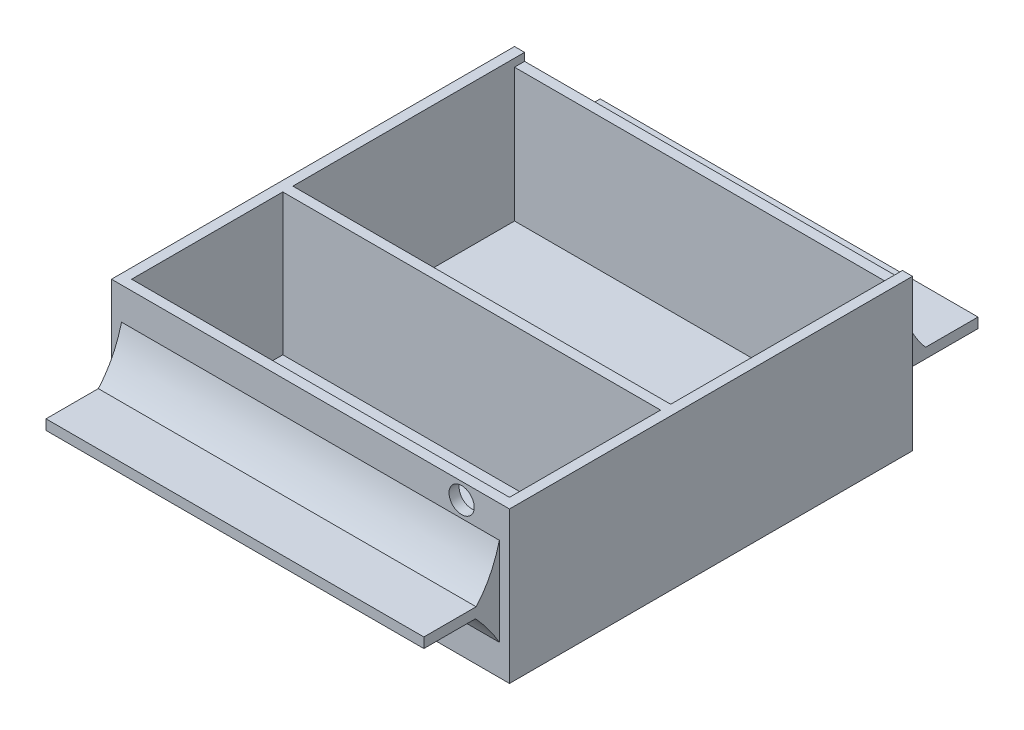
ISO-10303-21;
HEADER;
FILE_DESCRIPTION(('STEP AP214'),'2;1');
FILE_NAME('part.step','',(''),(''),'','','');
FILE_SCHEMA(('AUTOMOTIVE_DESIGN { 1 0 10303 214 1 1 1 1 }'));
ENDSEC;
DATA;
#1=APPLICATION_CONTEXT('core data for automotive mechanical design processes');
#2=APPLICATION_PROTOCOL_DEFINITION('international standard','automotive_design',2000,#1);
#3=PRODUCT_CONTEXT('',#1,'mechanical');
#4=PRODUCT('Part','Part','',(#3));
#5=PRODUCT_RELATED_PRODUCT_CATEGORY('part','',(#4));
#6=PRODUCT_DEFINITION_FORMATION('','',#4);
#7=PRODUCT_DEFINITION_CONTEXT('part definition',#1,'design');
#8=PRODUCT_DEFINITION('design','',#6,#7);
#9=PRODUCT_DEFINITION_SHAPE('','',#8);
#10=(LENGTH_UNIT() NAMED_UNIT(*) SI_UNIT(.MILLI.,.METRE.));
#11=(NAMED_UNIT(*) PLANE_ANGLE_UNIT() SI_UNIT($,.RADIAN.));
#12=(NAMED_UNIT(*) SI_UNIT($,.STERADIAN.) SOLID_ANGLE_UNIT());
#13=UNCERTAINTY_MEASURE_WITH_UNIT(LENGTH_MEASURE(1.E-05),#10,'distance_accuracy_value','');
#14=(GEOMETRIC_REPRESENTATION_CONTEXT(3) GLOBAL_UNCERTAINTY_ASSIGNED_CONTEXT((#13)) GLOBAL_UNIT_ASSIGNED_CONTEXT((#10,
#11,#12)) REPRESENTATION_CONTEXT('',''));
#15=CARTESIAN_POINT('',(0.,0.,0.));
#16=DIRECTION('',(0.,0.,1.));
#17=DIRECTION('',(1.,0.,0.));
#18=AXIS2_PLACEMENT_3D('',#15,#16,#17);
#19=CARTESIAN_POINT('',(150.,27.8925941027432,-190.));
#20=DIRECTION('',(0.,0.,-1.));
#21=DIRECTION('',(-1.,0.,0.));
#22=AXIS2_PLACEMENT_3D('',#19,#20,#21);
#23=PLANE('',#22);
#24=DIRECTION('',(1.,0.,0.));
#25=VECTOR('',#24,1.);
#26=CARTESIAN_POINT('',(-4.001,-4.,-190.));
#27=LINE('',#26,#25);
#28=CARTESIAN_POINT('',(0.,-4.,-190.));
#29=VERTEX_POINT('',#28);
#30=CARTESIAN_POINT('',(150.,-4.,-190.));
#31=VERTEX_POINT('',#30);
#32=EDGE_CURVE('E208',#29,#31,#27,.T.);
#33=ORIENTED_EDGE('',*,*,#32,.T.);
#34=DIRECTION('',(0.,-1.,0.));
#35=VECTOR('',#34,1.);
#36=CARTESIAN_POINT('',(150.,0.,-190.));
#37=LINE('',#36,#35);
#38=CARTESIAN_POINT('',(150.,18.2350424013927,-190.));
#39=VERTEX_POINT('',#38);
#40=EDGE_CURVE('E222',#39,#31,#37,.T.);
#41=ORIENTED_EDGE('',*,*,#40,.F.);
#42=DIRECTION('',(1.,0.,0.));
#43=VECTOR('',#42,1.);
#44=CARTESIAN_POINT('',(-20.5700401564044,18.2350424013927,-190.));
#45=LINE('',#44,#43);
#46=CARTESIAN_POINT('',(0.,18.2350424013927,-190.));
#47=VERTEX_POINT('',#46);
#48=EDGE_CURVE('E231',#47,#39,#45,.T.);
#49=ORIENTED_EDGE('',*,*,#48,.F.);
#50=DIRECTION('',(0.,1.,0.));
#51=VECTOR('',#50,1.);
#52=CARTESIAN_POINT('',(0.,0.,-190.));
#53=LINE('',#52,#51);
#54=EDGE_CURVE('E223',#29,#47,#53,.T.);
#55=ORIENTED_EDGE('',*,*,#54,.F.);
#56=EDGE_LOOP('',(#33,#41,#49,#55));
#57=FACE_BOUND('',#56,.T.);
#58=DIRECTION('',(-1.,0.,0.));
#59=VECTOR('',#58,1.);
#60=CARTESIAN_POINT('',(150.,-29.,-190.));
#61=LINE('',#60,#59);
#62=CARTESIAN_POINT('',(154.,-29.,-190.));
#63=VERTEX_POINT('',#62);
#64=CARTESIAN_POINT('',(-4.,-29.,-190.));
#65=VERTEX_POINT('',#64);
#66=EDGE_CURVE('E411',#63,#65,#61,.T.);
#67=ORIENTED_EDGE('',*,*,#66,.T.);
#68=DIRECTION('',(0.,-1.,0.));
#69=VECTOR('',#68,1.);
#70=CARTESIAN_POINT('',(-4.,31.,-190.));
#71=LINE('',#70,#69);
#72=CARTESIAN_POINT('',(-4.,31.,-190.));
#73=VERTEX_POINT('',#72);
#74=EDGE_CURVE('E303',#73,#65,#71,.T.);
#75=ORIENTED_EDGE('',*,*,#74,.F.);
#76=DIRECTION('',(1.,0.,0.));
#77=VECTOR('',#76,1.);
#78=CARTESIAN_POINT('',(-4.,31.,-190.));
#79=LINE('',#78,#77);
#80=CARTESIAN_POINT('',(0.,31.,-190.));
#81=VERTEX_POINT('',#80);
#82=EDGE_CURVE('E315',#73,#81,#79,.T.);
#83=ORIENTED_EDGE('',*,*,#82,.T.);
#84=DIRECTION('',(0.,-1.,0.));
#85=VECTOR('',#84,1.);
#86=CARTESIAN_POINT('',(0.,31.,-190.));
#87=LINE('',#86,#85);
#88=CARTESIAN_POINT('',(0.,27.8925941027432,-190.));
#89=VERTEX_POINT('',#88);
#90=EDGE_CURVE('E316',#81,#89,#87,.T.);
#91=ORIENTED_EDGE('',*,*,#90,.T.);
#92=DIRECTION('',(-1.,0.,0.));
#93=VECTOR('',#92,1.);
#94=CARTESIAN_POINT('',(150.,27.8925941027432,-190.));
#95=LINE('',#94,#93);
#96=CARTESIAN_POINT('',(150.,27.8925941027432,-190.));
#97=VERTEX_POINT('',#96);
#98=EDGE_CURVE('E408',#97,#89,#95,.T.);
#99=ORIENTED_EDGE('',*,*,#98,.F.);
#100=DIRECTION('',(0.,1.,0.));
#101=VECTOR('',#100,1.);
#102=CARTESIAN_POINT('',(150.,31.,-190.));
#103=LINE('',#102,#101);
#104=CARTESIAN_POINT('',(150.,31.,-190.));
#105=VERTEX_POINT('',#104);
#106=EDGE_CURVE('E323',#97,#105,#103,.T.);
#107=ORIENTED_EDGE('',*,*,#106,.T.);
#108=DIRECTION('',(-1.,0.,0.));
#109=VECTOR('',#108,1.);
#110=CARTESIAN_POINT('',(154.,31.,-190.));
#111=LINE('',#110,#109);
#112=CARTESIAN_POINT('',(154.,31.,-190.));
#113=VERTEX_POINT('',#112);
#114=EDGE_CURVE('E336',#113,#105,#111,.T.);
#115=ORIENTED_EDGE('',*,*,#114,.F.);
#116=DIRECTION('',(0.,1.,0.));
#117=VECTOR('',#116,1.);
#118=CARTESIAN_POINT('',(154.,31.,-190.));
#119=LINE('',#118,#117);
#120=EDGE_CURVE('E331',#63,#113,#119,.T.);
#121=ORIENTED_EDGE('',*,*,#120,.F.);
#122=EDGE_LOOP('',(#67,#75,#83,#91,#99,#107,#115,#121));
#123=FACE_BOUND('',#122,.T.);
#124=ADVANCED_FACE('F37',(#57,#123),#23,.T.);
#125=CARTESIAN_POINT('',(150.,-4.,-30.));
#126=DIRECTION('',(0.,0.,-1.));
#127=DIRECTION('',(0.,1.,0.));
#128=AXIS2_PLACEMENT_3D('',#125,#126,#127);
#129=PLANE('',#128);
#130=CARTESIAN_POINT('',(134.999120895242,24.5597285048767,-30.));
#131=DIRECTION('',(0.,0.,1.));
#132=DIRECTION('',(1.,0.,0.));
#133=AXIS2_PLACEMENT_3D('',#130,#131,#132);
#134=CIRCLE('',#133,4.99999999999999);
#135=CARTESIAN_POINT('',(139.999120895242,24.5597285048767,-30.));
#136=VERTEX_POINT('',#135);
#137=EDGE_CURVE('E705',#136,#136,#134,.T.);
#138=ORIENTED_EDGE('',*,*,#137,.F.);
#139=EDGE_LOOP('',(#138));
#140=FACE_BOUND('',#139,.T.);
#141=DIRECTION('',(0.,1.,0.));
#142=VECTOR('',#141,1.);
#143=CARTESIAN_POINT('',(-4.,31.,-30.));
#144=LINE('',#143,#142);
#145=CARTESIAN_POINT('',(-4.,-29.,-30.));
#146=VERTEX_POINT('',#145);
#147=CARTESIAN_POINT('',(-4.,31.,-30.));
#148=VERTEX_POINT('',#147);
#149=EDGE_CURVE('E310',#146,#148,#144,.T.);
#150=ORIENTED_EDGE('',*,*,#149,.F.);
#151=DIRECTION('',(-1.,0.,0.));
#152=VECTOR('',#151,1.);
#153=CARTESIAN_POINT('',(150.,-29.,-30.));
#154=LINE('',#153,#152);
#155=CARTESIAN_POINT('',(154.,-29.,-30.));
#156=VERTEX_POINT('',#155);
#157=EDGE_CURVE('E413',#156,#146,#154,.T.);
#158=ORIENTED_EDGE('',*,*,#157,.F.);
#159=DIRECTION('',(0.,-1.,0.));
#160=VECTOR('',#159,1.);
#161=CARTESIAN_POINT('',(154.,31.,-30.));
#162=LINE('',#161,#160);
#163=CARTESIAN_POINT('',(154.,31.,-30.));
#164=VERTEX_POINT('',#163);
#165=EDGE_CURVE('E324',#164,#156,#162,.T.);
#166=ORIENTED_EDGE('',*,*,#165,.F.);
#167=DIRECTION('',(-1.,0.,0.));
#168=VECTOR('',#167,1.);
#169=CARTESIAN_POINT('',(150.,31.,-30.));
#170=LINE('',#169,#168);
#171=EDGE_CURVE('E420',#164,#148,#170,.T.);
#172=ORIENTED_EDGE('',*,*,#171,.T.);
#173=EDGE_LOOP('',(#150,#158,#166,#172));
#174=FACE_BOUND('',#173,.T.);
#175=DIRECTION('',(0.,-1.,0.));
#176=VECTOR('',#175,1.);
#177=CARTESIAN_POINT('',(150.,31.,-30.));
#178=LINE('',#177,#176);
#179=CARTESIAN_POINT('',(150.,18.2350424013927,-30.));
#180=VERTEX_POINT('',#179);
#181=CARTESIAN_POINT('',(150.,-16.8510351394291,-30.));
#182=VERTEX_POINT('',#181);
#183=EDGE_CURVE('E46',#180,#182,#178,.T.);
#184=ORIENTED_EDGE('',*,*,#183,.T.);
#185=DIRECTION('',(1.,0.,0.));
#186=VECTOR('',#185,1.);
#187=CARTESIAN_POINT('',(-20.5700401564044,-16.8510351394291,-30.));
#188=LINE('',#187,#186);
#189=CARTESIAN_POINT('',(0.,-16.8510351394291,-30.));
#190=VERTEX_POINT('',#189);
#191=EDGE_CURVE('E250',#190,#182,#188,.T.);
#192=ORIENTED_EDGE('',*,*,#191,.F.);
#193=DIRECTION('',(0.,1.,0.));
#194=VECTOR('',#193,1.);
#195=CARTESIAN_POINT('',(0.,31.,-30.));
#196=LINE('',#195,#194);
#197=CARTESIAN_POINT('',(0.,18.2350424013927,-30.));
#198=VERTEX_POINT('',#197);
#199=EDGE_CURVE('E11',#190,#198,#196,.T.);
#200=ORIENTED_EDGE('',*,*,#199,.T.);
#201=DIRECTION('',(1.,0.,0.));
#202=VECTOR('',#201,1.);
#203=CARTESIAN_POINT('',(-20.5700401564044,18.2350424013927,-30.));
#204=LINE('',#203,#202);
#205=EDGE_CURVE('E300',#198,#180,#204,.T.);
#206=ORIENTED_EDGE('',*,*,#205,.T.);
#207=EDGE_LOOP('',(#184,#192,#200,#206));
#208=FACE_BOUND('',#207,.T.);
#209=ADVANCED_FACE('F463',(#140,#174,#208),#129,.F.);
#210=CARTESIAN_POINT('',(150.,-4.,0.));
#211=DIRECTION('',(0.,1.,0.));
#212=DIRECTION('',(0.,0.,1.));
#213=AXIS2_PLACEMENT_3D('',#210,#211,#212);
#214=PLANE('',#213);
#215=DIRECTION('',(1.,0.,0.));
#216=VECTOR('',#215,1.);
#217=CARTESIAN_POINT('',(-20.5700401564044,-4.,-20.5243542614954));
#218=LINE('',#217,#216);
#219=CARTESIAN_POINT('',(0.,-4.,-20.5243542614954));
#220=VERTEX_POINT('',#219);
#221=CARTESIAN_POINT('',(150.,-4.,-20.5243542614954));
#222=VERTEX_POINT('',#221);
#223=EDGE_CURVE('E774',#220,#222,#218,.T.);
#224=ORIENTED_EDGE('',*,*,#223,.T.);
#225=DIRECTION('',(0.,0.,-1.));
#226=VECTOR('',#225,1.);
#227=CARTESIAN_POINT('',(150.,-4.,0.));
#228=LINE('',#227,#226);
#229=CARTESIAN_POINT('',(150.,-4.,0.));
#230=VERTEX_POINT('',#229);
#231=EDGE_CURVE('E360',#230,#222,#228,.T.);
#232=ORIENTED_EDGE('',*,*,#231,.F.);
#233=DIRECTION('',(-1.,0.,0.));
#234=VECTOR('',#233,1.);
#235=CARTESIAN_POINT('',(150.,-4.,0.));
#236=LINE('',#235,#234);
#237=CARTESIAN_POINT('',(0.,-4.,0.));
#238=VERTEX_POINT('',#237);
#239=EDGE_CURVE('E415',#230,#238,#236,.T.);
#240=ORIENTED_EDGE('',*,*,#239,.T.);
#241=DIRECTION('',(0.,0.,-1.));
#242=VECTOR('',#241,1.);
#243=CARTESIAN_POINT('',(0.,-4.,0.));
#244=LINE('',#243,#242);
#245=EDGE_CURVE('E386',#238,#220,#244,.T.);
#246=ORIENTED_EDGE('',*,*,#245,.T.);
#247=EDGE_LOOP('',(#224,#232,#240,#246));
#248=FACE_BOUND('',#247,.T.);
#249=ADVANCED_FACE('F470',(#248),#214,.F.);
#250=CARTESIAN_POINT('',(0.,0.,0.));
#251=DIRECTION('',(1.,0.,0.));
#252=DIRECTION('',(0.,0.,-1.));
#253=AXIS2_PLACEMENT_3D('',#250,#251,#252);
#254=PLANE('',#253);
#255=CARTESIAN_POINT('',(0.,18.2350424013927,-30.));
#256=CARTESIAN_POINT('',(0.,7.09284210126687,-27.1622608232725));
#257=CARTESIAN_POINT('',(0.,0.,-20.7614223529874));
#258=B_SPLINE_CURVE_WITH_KNOTS('',2,(#255,#256,#257),.UNSPECIFIED.,.F.,.F.,(3,3),(0.,1.),.UNSPECIFIED.);
#259=CARTESIAN_POINT('',(0.,0.,-20.7614223529874));
#260=VERTEX_POINT('',#259);
#261=EDGE_CURVE('E285',#260,#198,#258,.F.);
#262=ORIENTED_EDGE('',*,*,#261,.T.);
#263=ORIENTED_EDGE('',*,*,#199,.F.);
#264=CARTESIAN_POINT('',(0.,-16.8510351394291,-30.));
#265=CARTESIAN_POINT('',(0.,-10.331662623398,-26.3325225030504));
#266=CARTESIAN_POINT('',(0.,-4.,-20.5243542614954));
#267=B_SPLINE_CURVE_WITH_KNOTS('',2,(#264,#265,#266),.UNSPECIFIED.,.F.,.F.,(3,3),(0.,1.),.UNSPECIFIED.);
#268=EDGE_CURVE('E244',#220,#190,#267,.F.);
#269=ORIENTED_EDGE('',*,*,#268,.F.);
#270=ORIENTED_EDGE('',*,*,#245,.F.);
#271=DIRECTION('',(0.,-1.,0.));
#272=VECTOR('',#271,1.);
#273=CARTESIAN_POINT('',(0.,0.,0.));
#274=LINE('',#273,#272);
#275=CARTESIAN_POINT('',(0.,0.,0.));
#276=VERTEX_POINT('',#275);
#277=EDGE_CURVE('E384',#276,#238,#274,.T.);
#278=ORIENTED_EDGE('',*,*,#277,.F.);
#279=DIRECTION('',(0.,0.,-1.));
#280=VECTOR('',#279,1.);
#281=CARTESIAN_POINT('',(0.,0.,0.));
#282=LINE('',#281,#280);
#283=EDGE_CURVE('E382',#276,#260,#282,.T.);
#284=ORIENTED_EDGE('',*,*,#283,.T.);
#285=EDGE_LOOP('',(#262,#263,#269,#270,#278,#284));
#286=FACE_BOUND('',#285,.T.);
#287=ADVANCED_FACE('F460',(#286),#254,.F.);
#288=CARTESIAN_POINT('',(150.,31.,-94.));
#289=DIRECTION('',(0.,0.,-1.));
#290=DIRECTION('',(-1.,0.,0.));
#291=AXIS2_PLACEMENT_3D('',#288,#289,#290);
#292=PLANE('',#291);
#293=CARTESIAN_POINT('',(137.288939055723,2.62555121019778,-94.));
#294=DIRECTION('',(0.,0.,-1.));
#295=DIRECTION('',(-1.,0.,0.));
#296=AXIS2_PLACEMENT_3D('',#293,#294,#295);
#297=CIRCLE('',#296,10.);
#298=CARTESIAN_POINT('',(127.288939055723,2.62555121019778,-94.));
#299=VERTEX_POINT('',#298);
#300=EDGE_CURVE('E224',#299,#299,#297,.T.);
#301=ORIENTED_EDGE('',*,*,#300,.T.);
#302=EDGE_LOOP('',(#301));
#303=FACE_BOUND('',#302,.T.);
#304=DIRECTION('',(0.,-1.,0.));
#305=VECTOR('',#304,1.);
#306=CARTESIAN_POINT('',(0.,31.,-94.));
#307=LINE('',#306,#305);
#308=CARTESIAN_POINT('',(0.,31.,-94.));
#309=VERTEX_POINT('',#308);
#310=CARTESIAN_POINT('',(0.,-25.,-94.));
#311=VERTEX_POINT('',#310);
#312=EDGE_CURVE('E345',#309,#311,#307,.T.);
#313=ORIENTED_EDGE('',*,*,#312,.T.);
#314=DIRECTION('',(-1.,0.,0.));
#315=VECTOR('',#314,1.);
#316=CARTESIAN_POINT('',(150.,-25.,-94.));
#317=LINE('',#316,#315);
#318=CARTESIAN_POINT('',(150.,-25.,-94.));
#319=VERTEX_POINT('',#318);
#320=EDGE_CURVE('E428',#319,#311,#317,.T.);
#321=ORIENTED_EDGE('',*,*,#320,.F.);
#322=DIRECTION('',(0.,-1.,0.));
#323=VECTOR('',#322,1.);
#324=CARTESIAN_POINT('',(150.,31.,-94.));
#325=LINE('',#324,#323);
#326=CARTESIAN_POINT('',(150.,31.,-94.));
#327=VERTEX_POINT('',#326);
#328=EDGE_CURVE('E346',#327,#319,#325,.T.);
#329=ORIENTED_EDGE('',*,*,#328,.F.);
#330=DIRECTION('',(-1.,0.,0.));
#331=VECTOR('',#330,1.);
#332=CARTESIAN_POINT('',(150.,31.,-94.));
#333=LINE('',#332,#331);
#334=EDGE_CURVE('E338',#327,#309,#333,.T.);
#335=ORIENTED_EDGE('',*,*,#334,.T.);
#336=EDGE_LOOP('',(#313,#321,#329,#335));
#337=FACE_BOUND('',#336,.T.);
#338=ADVANCED_FACE('F39',(#303,#337),#292,.F.);
#339=CARTESIAN_POINT('',(150.,-25.,-34.));
#340=DIRECTION('',(0.,1.,0.));
#341=DIRECTION('',(0.,0.,1.));
#342=AXIS2_PLACEMENT_3D('',#339,#340,#341);
#343=PLANE('',#342);
#344=DIRECTION('',(0.,0.,-1.));
#345=VECTOR('',#344,1.);
#346=CARTESIAN_POINT('',(0.,-25.,-34.));
#347=LINE('',#346,#345);
#348=CARTESIAN_POINT('',(0.,-25.,-34.));
#349=VERTEX_POINT('',#348);
#350=EDGE_CURVE('E378',#349,#311,#347,.T.);
#351=ORIENTED_EDGE('',*,*,#350,.F.);
#352=DIRECTION('',(-1.,0.,0.));
#353=VECTOR('',#352,1.);
#354=CARTESIAN_POINT('',(150.,-25.,-34.));
#355=LINE('',#354,#353);
#356=CARTESIAN_POINT('',(150.,-25.,-34.));
#357=VERTEX_POINT('',#356);
#358=EDGE_CURVE('E425',#357,#349,#355,.T.);
#359=ORIENTED_EDGE('',*,*,#358,.F.);
#360=DIRECTION('',(0.,0.,-1.));
#361=VECTOR('',#360,1.);
#362=CARTESIAN_POINT('',(150.,-25.,-34.));
#363=LINE('',#362,#361);
#364=EDGE_CURVE('E349',#357,#319,#363,.T.);
#365=ORIENTED_EDGE('',*,*,#364,.T.);
#366=ORIENTED_EDGE('',*,*,#320,.T.);
#367=EDGE_LOOP('',(#351,#359,#365,#366));
#368=FACE_BOUND('',#367,.T.);
#369=ADVANCED_FACE('F450',(#368),#343,.T.);
#370=CARTESIAN_POINT('',(150.,31.,-34.));
#371=DIRECTION('',(0.,0.,-1.));
#372=DIRECTION('',(0.,1.,0.));
#373=AXIS2_PLACEMENT_3D('',#370,#371,#372);
#374=PLANE('',#373);
#375=CARTESIAN_POINT('',(134.999120895242,24.5597285048767,-34.));
#376=DIRECTION('',(0.,0.,-1.));
#377=DIRECTION('',(0.,1.,0.));
#378=AXIS2_PLACEMENT_3D('',#375,#376,#377);
#379=CIRCLE('',#378,4.99999999999999);
#380=CARTESIAN_POINT('',(134.999120895242,29.5597285048767,-34.));
#381=VERTEX_POINT('',#380);
#382=EDGE_CURVE('E41',#381,#381,#379,.T.);
#383=ORIENTED_EDGE('',*,*,#382,.F.);
#384=EDGE_LOOP('',(#383));
#385=FACE_BOUND('',#384,.T.);
#386=DIRECTION('',(0.,-1.,0.));
#387=VECTOR('',#386,1.);
#388=CARTESIAN_POINT('',(0.,31.,-34.));
#389=LINE('',#388,#387);
#390=CARTESIAN_POINT('',(0.,31.,-34.));
#391=VERTEX_POINT('',#390);
#392=EDGE_CURVE('E380',#391,#349,#389,.T.);
#393=ORIENTED_EDGE('',*,*,#392,.F.);
#394=DIRECTION('',(-1.,0.,0.));
#395=VECTOR('',#394,1.);
#396=CARTESIAN_POINT('',(150.,31.,-34.));
#397=LINE('',#396,#395);
#398=CARTESIAN_POINT('',(150.,31.,-34.));
#399=VERTEX_POINT('',#398);
#400=EDGE_CURVE('E422',#399,#391,#397,.T.);
#401=ORIENTED_EDGE('',*,*,#400,.F.);
#402=DIRECTION('',(0.,-1.,0.));
#403=VECTOR('',#402,1.);
#404=CARTESIAN_POINT('',(150.,31.,-34.));
#405=LINE('',#404,#403);
#406=EDGE_CURVE('E353',#399,#357,#405,.T.);
#407=ORIENTED_EDGE('',*,*,#406,.T.);
#408=ORIENTED_EDGE('',*,*,#358,.T.);
#409=EDGE_LOOP('',(#393,#401,#407,#408));
#410=FACE_BOUND('',#409,.T.);
#411=ADVANCED_FACE('F445',(#385,#410),#374,.T.);
#412=CARTESIAN_POINT('',(150.,31.,-34.));
#413=DIRECTION('',(0.,-1.,0.));
#414=DIRECTION('',(0.,0.,-1.));
#415=AXIS2_PLACEMENT_3D('',#412,#413,#414);
#416=PLANE('',#415);
#417=DIRECTION('',(0.,0.,-1.));
#418=VECTOR('',#417,1.);
#419=CARTESIAN_POINT('',(0.,31.,-190.));
#420=LINE('',#419,#418);
#421=EDGE_CURVE('E307',#391,#309,#420,.T.);
#422=ORIENTED_EDGE('',*,*,#421,.T.);
#423=ORIENTED_EDGE('',*,*,#334,.F.);
#424=DIRECTION('',(0.,0.,1.));
#425=VECTOR('',#424,1.);
#426=CARTESIAN_POINT('',(150.,31.,-30.));
#427=LINE('',#426,#425);
#428=EDGE_CURVE('E340',#327,#399,#427,.T.);
#429=ORIENTED_EDGE('',*,*,#428,.T.);
#430=ORIENTED_EDGE('',*,*,#400,.T.);
#431=EDGE_LOOP('',(#422,#423,#429,#430));
#432=FACE_BOUND('',#431,.T.);
#433=DIRECTION('',(-1.,0.,0.));
#434=VECTOR('',#433,1.);
#435=CARTESIAN_POINT('',(150.,31.,-98.));
#436=LINE('',#435,#434);
#437=CARTESIAN_POINT('',(150.,31.,-98.));
#438=VERTEX_POINT('',#437);
#439=CARTESIAN_POINT('',(0.,31.,-98.));
#440=VERTEX_POINT('',#439);
#441=EDGE_CURVE('E375',#438,#440,#436,.T.);
#442=ORIENTED_EDGE('',*,*,#441,.T.);
#443=EDGE_CURVE('E318',#440,#81,#420,.T.);
#444=ORIENTED_EDGE('',*,*,#443,.T.);
#445=ORIENTED_EDGE('',*,*,#82,.F.);
#446=DIRECTION('',(0.,0.,-1.));
#447=VECTOR('',#446,1.);
#448=CARTESIAN_POINT('',(-4.,31.,-190.));
#449=LINE('',#448,#447);
#450=EDGE_CURVE('E313',#148,#73,#449,.T.);
#451=ORIENTED_EDGE('',*,*,#450,.F.);
#452=ORIENTED_EDGE('',*,*,#171,.F.);
#453=DIRECTION('',(0.,0.,1.));
#454=VECTOR('',#453,1.);
#455=CARTESIAN_POINT('',(154.,31.,-30.));
#456=LINE('',#455,#454);
#457=EDGE_CURVE('E333',#113,#164,#456,.T.);
#458=ORIENTED_EDGE('',*,*,#457,.F.);
#459=ORIENTED_EDGE('',*,*,#114,.T.);
#460=EDGE_CURVE('E328',#105,#438,#427,.T.);
#461=ORIENTED_EDGE('',*,*,#460,.T.);
#462=EDGE_LOOP('',(#442,#444,#445,#451,#452,#458,#459,#461));
#463=FACE_BOUND('',#462,.T.);
#464=ADVANCED_FACE('F437',(#432,#463),#416,.F.);
#465=CARTESIAN_POINT('',(150.,0.,0.));
#466=DIRECTION('',(0.,1.,0.));
#467=DIRECTION('',(0.,0.,1.));
#468=AXIS2_PLACEMENT_3D('',#465,#466,#467);
#469=PLANE('',#468);
#470=DIRECTION('',(1.,0.,0.));
#471=VECTOR('',#470,1.);
#472=CARTESIAN_POINT('',(-20.5700401564044,0.,-20.7614223529874));
#473=LINE('',#472,#471);
#474=CARTESIAN_POINT('',(150.,0.,-20.7614223529874));
#475=VERTEX_POINT('',#474);
#476=EDGE_CURVE('E62',#260,#475,#473,.T.);
#477=ORIENTED_EDGE('',*,*,#476,.F.);
#478=ORIENTED_EDGE('',*,*,#283,.F.);
#479=DIRECTION('',(-1.,0.,0.));
#480=VECTOR('',#479,1.);
#481=CARTESIAN_POINT('',(150.,0.,0.));
#482=LINE('',#481,#480);
#483=CARTESIAN_POINT('',(150.,0.,0.));
#484=VERTEX_POINT('',#483);
#485=EDGE_CURVE('E418',#484,#276,#482,.T.);
#486=ORIENTED_EDGE('',*,*,#485,.F.);
#487=DIRECTION('',(0.,0.,-1.));
#488=VECTOR('',#487,1.);
#489=CARTESIAN_POINT('',(150.,0.,0.));
#490=LINE('',#489,#488);
#491=EDGE_CURVE('E356',#484,#475,#490,.T.);
#492=ORIENTED_EDGE('',*,*,#491,.T.);
#493=EDGE_LOOP('',(#477,#478,#486,#492));
#494=FACE_BOUND('',#493,.T.);
#495=ADVANCED_FACE('F487',(#494),#469,.T.);
#496=CARTESIAN_POINT('',(150.,0.,0.));
#497=DIRECTION('',(0.,0.,-1.));
#498=DIRECTION('',(0.,1.,0.));
#499=AXIS2_PLACEMENT_3D('',#496,#497,#498);
#500=PLANE('',#499);
#501=ORIENTED_EDGE('',*,*,#277,.T.);
#502=ORIENTED_EDGE('',*,*,#239,.F.);
#503=DIRECTION('',(0.,-1.,0.));
#504=VECTOR('',#503,1.);
#505=CARTESIAN_POINT('',(150.,0.,0.));
#506=LINE('',#505,#504);
#507=EDGE_CURVE('E358',#484,#230,#506,.T.);
#508=ORIENTED_EDGE('',*,*,#507,.F.);
#509=ORIENTED_EDGE('',*,*,#485,.T.);
#510=EDGE_LOOP('',(#501,#502,#508,#509));
#511=FACE_BOUND('',#510,.T.);
#512=ADVANCED_FACE('F479',(#511),#500,.F.);
#513=CARTESIAN_POINT('',(150.,-29.,-30.));
#514=DIRECTION('',(0.,1.,0.));
#515=DIRECTION('',(0.,0.,1.));
#516=AXIS2_PLACEMENT_3D('',#513,#514,#515);
#517=PLANE('',#516);
#518=ORIENTED_EDGE('',*,*,#157,.T.);
#519=DIRECTION('',(0.,0.,1.));
#520=VECTOR('',#519,1.);
#521=CARTESIAN_POINT('',(-4.,-29.,-190.));
#522=LINE('',#521,#520);
#523=EDGE_CURVE('E306',#65,#146,#522,.T.);
#524=ORIENTED_EDGE('',*,*,#523,.F.);
#525=ORIENTED_EDGE('',*,*,#66,.F.);
#526=DIRECTION('',(0.,0.,-1.));
#527=VECTOR('',#526,1.);
#528=CARTESIAN_POINT('',(154.,-29.,-30.));
#529=LINE('',#528,#527);
#530=EDGE_CURVE('E327',#156,#63,#529,.T.);
#531=ORIENTED_EDGE('',*,*,#530,.F.);
#532=EDGE_LOOP('',(#518,#524,#525,#531));
#533=FACE_BOUND('',#532,.T.);
#534=ADVANCED_FACE('F477',(#533),#517,.F.);
#535=CARTESIAN_POINT('',(150.,27.8925941027432,-186.));
#536=DIRECTION('',(0.,1.,0.));
#537=DIRECTION('',(0.,0.,1.));
#538=AXIS2_PLACEMENT_3D('',#535,#536,#537);
#539=PLANE('',#538);
#540=DIRECTION('',(0.,0.,-1.));
#541=VECTOR('',#540,1.);
#542=CARTESIAN_POINT('',(0.,27.8925941027432,-186.));
#543=LINE('',#542,#541);
#544=CARTESIAN_POINT('',(0.,27.8925941027432,-186.));
#545=VERTEX_POINT('',#544);
#546=EDGE_CURVE('E389',#545,#89,#543,.T.);
#547=ORIENTED_EDGE('',*,*,#546,.F.);
#548=DIRECTION('',(-1.,0.,0.));
#549=VECTOR('',#548,1.);
#550=CARTESIAN_POINT('',(150.,27.8925941027432,-186.));
#551=LINE('',#550,#549);
#552=CARTESIAN_POINT('',(150.,27.8925941027432,-186.));
#553=VERTEX_POINT('',#552);
#554=EDGE_CURVE('E405',#553,#545,#551,.T.);
#555=ORIENTED_EDGE('',*,*,#554,.F.);
#556=DIRECTION('',(0.,0.,-1.));
#557=VECTOR('',#556,1.);
#558=CARTESIAN_POINT('',(150.,27.8925941027432,-186.));
#559=LINE('',#558,#557);
#560=EDGE_CURVE('E363',#553,#97,#559,.T.);
#561=ORIENTED_EDGE('',*,*,#560,.T.);
#562=ORIENTED_EDGE('',*,*,#98,.T.);
#563=EDGE_LOOP('',(#547,#555,#561,#562));
#564=FACE_BOUND('',#563,.T.);
#565=ADVANCED_FACE('F475',(#564),#539,.T.);
#566=CARTESIAN_POINT('',(150.,-25.,-186.));
#567=DIRECTION('',(0.,0.,1.));
#568=DIRECTION('',(1.,0.,0.));
#569=AXIS2_PLACEMENT_3D('',#566,#567,#568);
#570=PLANE('',#569);
#571=DIRECTION('',(0.,1.,0.));
#572=VECTOR('',#571,1.);
#573=CARTESIAN_POINT('',(0.,-25.,-186.));
#574=LINE('',#573,#572);
#575=CARTESIAN_POINT('',(0.,-25.,-186.));
#576=VERTEX_POINT('',#575);
#577=EDGE_CURVE('E391',#576,#545,#574,.T.);
#578=ORIENTED_EDGE('',*,*,#577,.F.);
#579=DIRECTION('',(-1.,0.,0.));
#580=VECTOR('',#579,1.);
#581=CARTESIAN_POINT('',(150.,-25.,-186.));
#582=LINE('',#581,#580);
#583=CARTESIAN_POINT('',(150.,-25.,-186.));
#584=VERTEX_POINT('',#583);
#585=EDGE_CURVE('E402',#584,#576,#582,.T.);
#586=ORIENTED_EDGE('',*,*,#585,.F.);
#587=DIRECTION('',(0.,1.,0.));
#588=VECTOR('',#587,1.);
#589=CARTESIAN_POINT('',(150.,-25.,-186.));
#590=LINE('',#589,#588);
#591=EDGE_CURVE('E366',#584,#553,#590,.T.);
#592=ORIENTED_EDGE('',*,*,#591,.T.);
#593=ORIENTED_EDGE('',*,*,#554,.T.);
#594=EDGE_LOOP('',(#578,#586,#592,#593));
#595=FACE_BOUND('',#594,.T.);
#596=ADVANCED_FACE('F520',(#595),#570,.T.);
#597=CARTESIAN_POINT('',(150.,-25.,-98.));
#598=DIRECTION('',(0.,1.,0.));
#599=DIRECTION('',(0.,0.,1.));
#600=AXIS2_PLACEMENT_3D('',#597,#598,#599);
#601=PLANE('',#600);
#602=DIRECTION('',(0.,0.,-1.));
#603=VECTOR('',#602,1.);
#604=CARTESIAN_POINT('',(0.,-25.,-98.));
#605=LINE('',#604,#603);
#606=CARTESIAN_POINT('',(0.,-25.,-98.));
#607=VERTEX_POINT('',#606);
#608=EDGE_CURVE('E393',#607,#576,#605,.T.);
#609=ORIENTED_EDGE('',*,*,#608,.F.);
#610=DIRECTION('',(-1.,0.,0.));
#611=VECTOR('',#610,1.);
#612=CARTESIAN_POINT('',(150.,-25.,-98.));
#613=LINE('',#612,#611);
#614=CARTESIAN_POINT('',(150.,-25.,-98.));
#615=VERTEX_POINT('',#614);
#616=EDGE_CURVE('E399',#615,#607,#613,.T.);
#617=ORIENTED_EDGE('',*,*,#616,.F.);
#618=DIRECTION('',(0.,0.,-1.));
#619=VECTOR('',#618,1.);
#620=CARTESIAN_POINT('',(150.,-25.,-98.));
#621=LINE('',#620,#619);
#622=EDGE_CURVE('E369',#615,#584,#621,.T.);
#623=ORIENTED_EDGE('',*,*,#622,.T.);
#624=ORIENTED_EDGE('',*,*,#585,.T.);
#625=EDGE_LOOP('',(#609,#617,#623,#624));
#626=FACE_BOUND('',#625,.T.);
#627=ADVANCED_FACE('F527',(#626),#601,.T.);
#628=CARTESIAN_POINT('',(150.,-25.,-98.));
#629=DIRECTION('',(0.,0.,1.));
#630=DIRECTION('',(0.,-1.,0.));
#631=AXIS2_PLACEMENT_3D('',#628,#629,#630);
#632=PLANE('',#631);
#633=CARTESIAN_POINT('',(137.288939055723,2.62555121019778,-98.));
#634=DIRECTION('',(0.,0.,-1.));
#635=DIRECTION('',(0.,1.,0.));
#636=AXIS2_PLACEMENT_3D('',#633,#634,#635);
#637=CIRCLE('',#636,10.);
#638=CARTESIAN_POINT('',(137.288939055723,12.6255512101978,-98.));
#639=VERTEX_POINT('',#638);
#640=EDGE_CURVE('E707',#639,#639,#637,.T.);
#641=ORIENTED_EDGE('',*,*,#640,.F.);
#642=EDGE_LOOP('',(#641));
#643=FACE_BOUND('',#642,.T.);
#644=DIRECTION('',(0.,1.,0.));
#645=VECTOR('',#644,1.);
#646=CARTESIAN_POINT('',(0.,-25.,-98.));
#647=LINE('',#646,#645);
#648=EDGE_CURVE('E350',#607,#440,#647,.T.);
#649=ORIENTED_EDGE('',*,*,#648,.T.);
#650=ORIENTED_EDGE('',*,*,#441,.F.);
#651=DIRECTION('',(0.,1.,0.));
#652=VECTOR('',#651,1.);
#653=CARTESIAN_POINT('',(150.,-25.,-98.));
#654=LINE('',#653,#652);
#655=EDGE_CURVE('E372',#615,#438,#654,.T.);
#656=ORIENTED_EDGE('',*,*,#655,.F.);
#657=ORIENTED_EDGE('',*,*,#616,.T.);
#658=EDGE_LOOP('',(#649,#650,#656,#657));
#659=FACE_BOUND('',#658,.T.);
#660=ADVANCED_FACE('F534',(#643,#659),#632,.F.);
#661=CARTESIAN_POINT('',(150.,0.,0.));
#662=DIRECTION('',(1.,0.,0.));
#663=DIRECTION('',(0.,0.,-1.));
#664=AXIS2_PLACEMENT_3D('',#661,#662,#663);
#665=PLANE('',#664);
#666=ORIENTED_EDGE('',*,*,#183,.F.);
#667=CARTESIAN_POINT('',(150.,18.2350424013927,-30.));
#668=CARTESIAN_POINT('',(150.,7.09284210126687,-27.1622608232725));
#669=CARTESIAN_POINT('',(150.,0.,-20.7614223529874));
#670=B_SPLINE_CURVE_WITH_KNOTS('',2,(#667,#668,#669),.UNSPECIFIED.,.F.,.F.,(3,3),(0.,1.),.UNSPECIFIED.);
#671=EDGE_CURVE('E249',#180,#475,#670,.T.);
#672=ORIENTED_EDGE('',*,*,#671,.T.);
#673=ORIENTED_EDGE('',*,*,#491,.F.);
#674=ORIENTED_EDGE('',*,*,#507,.T.);
#675=ORIENTED_EDGE('',*,*,#231,.T.);
#676=CARTESIAN_POINT('',(150.,-16.8510351394291,-30.));
#677=CARTESIAN_POINT('',(150.,-10.331662623398,-26.3325225030504));
#678=CARTESIAN_POINT('',(150.,-4.,-20.5243542614954));
#679=B_SPLINE_CURVE_WITH_KNOTS('',2,(#676,#677,#678),.UNSPECIFIED.,.F.,.F.,(3,3),(0.,1.),.UNSPECIFIED.);
#680=EDGE_CURVE('E243',#182,#222,#679,.T.);
#681=ORIENTED_EDGE('',*,*,#680,.F.);
#682=EDGE_LOOP('',(#666,#672,#673,#674,#675,#681));
#683=FACE_BOUND('',#682,.T.);
#684=ADVANCED_FACE('F544',(#683),#665,.T.);
#685=CARTESIAN_POINT('',(150.,0.,0.));
#686=DIRECTION('',(1.,0.,0.));
#687=DIRECTION('',(0.,0.,-1.));
#688=AXIS2_PLACEMENT_3D('',#685,#686,#687);
#689=PLANE('',#688);
#690=ORIENTED_EDGE('',*,*,#428,.F.);
#691=ORIENTED_EDGE('',*,*,#328,.T.);
#692=ORIENTED_EDGE('',*,*,#364,.F.);
#693=ORIENTED_EDGE('',*,*,#406,.F.);
#694=EDGE_LOOP('',(#690,#691,#692,#693));
#695=FACE_BOUND('',#694,.T.);
#696=ADVANCED_FACE('F441',(#695),#689,.F.);
#697=CARTESIAN_POINT('',(154.,0.,0.));
#698=DIRECTION('',(1.,0.,0.));
#699=DIRECTION('',(0.,0.,-1.));
#700=AXIS2_PLACEMENT_3D('',#697,#698,#699);
#701=PLANE('',#700);
#702=ORIENTED_EDGE('',*,*,#165,.T.);
#703=ORIENTED_EDGE('',*,*,#530,.T.);
#704=ORIENTED_EDGE('',*,*,#120,.T.);
#705=ORIENTED_EDGE('',*,*,#457,.T.);
#706=EDGE_LOOP('',(#702,#703,#704,#705));
#707=FACE_BOUND('',#706,.T.);
#708=ADVANCED_FACE('F554',(#707),#701,.T.);
#709=ORIENTED_EDGE('',*,*,#560,.F.);
#710=ORIENTED_EDGE('',*,*,#591,.F.);
#711=ORIENTED_EDGE('',*,*,#622,.F.);
#712=ORIENTED_EDGE('',*,*,#655,.T.);
#713=ORIENTED_EDGE('',*,*,#460,.F.);
#714=ORIENTED_EDGE('',*,*,#106,.F.);
#715=EDGE_LOOP('',(#709,#710,#711,#712,#713,#714));
#716=FACE_BOUND('',#715,.T.);
#717=ADVANCED_FACE('F556',(#716),#689,.F.);
#718=CARTESIAN_POINT('',(0.,0.,0.));
#719=DIRECTION('',(-1.,0.,0.));
#720=DIRECTION('',(0.,0.,1.));
#721=AXIS2_PLACEMENT_3D('',#718,#719,#720);
#722=PLANE('',#721);
#723=ORIENTED_EDGE('',*,*,#421,.F.);
#724=ORIENTED_EDGE('',*,*,#392,.T.);
#725=ORIENTED_EDGE('',*,*,#350,.T.);
#726=ORIENTED_EDGE('',*,*,#312,.F.);
#727=EDGE_LOOP('',(#723,#724,#725,#726));
#728=FACE_BOUND('',#727,.T.);
#729=ADVANCED_FACE('F448',(#728),#722,.F.);
#730=CARTESIAN_POINT('',(-4.,0.,0.));
#731=DIRECTION('',(-1.,0.,0.));
#732=DIRECTION('',(0.,0.,1.));
#733=AXIS2_PLACEMENT_3D('',#730,#731,#732);
#734=PLANE('',#733);
#735=ORIENTED_EDGE('',*,*,#74,.T.);
#736=ORIENTED_EDGE('',*,*,#523,.T.);
#737=ORIENTED_EDGE('',*,*,#149,.T.);
#738=ORIENTED_EDGE('',*,*,#450,.T.);
#739=EDGE_LOOP('',(#735,#736,#737,#738));
#740=FACE_BOUND('',#739,.T.);
#741=ADVANCED_FACE('F278',(#740),#734,.T.);
#742=ORIENTED_EDGE('',*,*,#648,.F.);
#743=ORIENTED_EDGE('',*,*,#608,.T.);
#744=ORIENTED_EDGE('',*,*,#577,.T.);
#745=ORIENTED_EDGE('',*,*,#546,.T.);
#746=ORIENTED_EDGE('',*,*,#90,.F.);
#747=ORIENTED_EDGE('',*,*,#443,.F.);
#748=EDGE_LOOP('',(#742,#743,#744,#745,#746,#747));
#749=FACE_BOUND('',#748,.T.);
#750=ADVANCED_FACE('F276',(#749),#722,.F.);
#751=CARTESIAN_POINT('',(-20.5700401564044,18.2350424013927,-30.));
#752=CARTESIAN_POINT('',(-20.5700401564044,7.09284210126687,-27.1622608232725));
#753=CARTESIAN_POINT('',(-20.5700401564044,0.,-20.7614223529874));
#754=B_SPLINE_CURVE_WITH_KNOTS('',2,(#751,#752,#753),.UNSPECIFIED.,.F.,.F.,(3,3),(0.,1.),.UNSPECIFIED.);
#755=DIRECTION('',(1.,0.,0.));
#756=VECTOR('',#755,1.);
#757=SURFACE_OF_LINEAR_EXTRUSION('',#754,#756);
#758=ORIENTED_EDGE('',*,*,#261,.F.);
#759=ORIENTED_EDGE('',*,*,#476,.T.);
#760=ORIENTED_EDGE('',*,*,#671,.F.);
#761=ORIENTED_EDGE('',*,*,#205,.F.);
#762=EDGE_LOOP('',(#758,#759,#760,#761));
#763=FACE_BOUND('',#762,.T.);
#764=ADVANCED_FACE('F270',(#763),#757,.T.);
#765=CARTESIAN_POINT('',(-20.5700401564044,-16.8510351394291,-30.));
#766=CARTESIAN_POINT('',(-20.5700401564044,-10.331662623398,-26.3325225030504));
#767=CARTESIAN_POINT('',(-20.5700401564044,-4.,-20.5243542614954));
#768=B_SPLINE_CURVE_WITH_KNOTS('',2,(#765,#766,#767),.UNSPECIFIED.,.F.,.F.,(3,3),(0.,1.),.UNSPECIFIED.);
#769=DIRECTION('',(1.,0.,0.));
#770=VECTOR('',#769,1.);
#771=SURFACE_OF_LINEAR_EXTRUSION('',#768,#770);
#772=ORIENTED_EDGE('',*,*,#223,.F.);
#773=ORIENTED_EDGE('',*,*,#268,.T.);
#774=ORIENTED_EDGE('',*,*,#191,.T.);
#775=ORIENTED_EDGE('',*,*,#680,.T.);
#776=EDGE_LOOP('',(#772,#773,#774,#775));
#777=FACE_BOUND('',#776,.T.);
#778=ADVANCED_FACE('F265',(#777),#771,.F.);
#779=CARTESIAN_POINT('',(-20.5700401564044,18.2350424013927,-190.));
#780=CARTESIAN_POINT('',(-20.5700401564044,7.09284210126687,-192.837739176727));
#781=CARTESIAN_POINT('',(-20.5700401564044,0.,-199.238577647013));
#782=B_SPLINE_CURVE_WITH_KNOTS('',2,(#779,#780,#781),.UNSPECIFIED.,.F.,.F.,(3,3),(0.,1.),.UNSPECIFIED.);
#783=DIRECTION('',(1.,0.,0.));
#784=VECTOR('',#783,1.);
#785=SURFACE_OF_LINEAR_EXTRUSION('',#782,#784);
#786=DIRECTION('',(1.,0.,0.));
#787=VECTOR('',#786,1.);
#788=CARTESIAN_POINT('',(-20.5700401564044,0.,-199.238577647013));
#789=LINE('',#788,#787);
#790=CARTESIAN_POINT('',(0.,0.,-199.238577647013));
#791=VERTEX_POINT('',#790);
#792=CARTESIAN_POINT('',(150.,0.,-199.238577647013));
#793=VERTEX_POINT('',#792);
#794=EDGE_CURVE('E233',#791,#793,#789,.T.);
#795=ORIENTED_EDGE('',*,*,#794,.F.);
#796=CARTESIAN_POINT('',(0.,18.2350424013927,-190.));
#797=CARTESIAN_POINT('',(0.,7.09284210126687,-192.837739176727));
#798=CARTESIAN_POINT('',(0.,0.,-199.238577647013));
#799=B_SPLINE_CURVE_WITH_KNOTS('',2,(#796,#797,#798),.UNSPECIFIED.,.F.,.F.,(3,3),(0.,1.),.UNSPECIFIED.);
#800=EDGE_CURVE('E241',#791,#47,#799,.F.);
#801=ORIENTED_EDGE('',*,*,#800,.T.);
#802=ORIENTED_EDGE('',*,*,#48,.T.);
#803=CARTESIAN_POINT('',(150.,18.2350424013927,-190.));
#804=CARTESIAN_POINT('',(150.,7.09284210126687,-192.837739176727));
#805=CARTESIAN_POINT('',(150.,0.,-199.238577647013));
#806=B_SPLINE_CURVE_WITH_KNOTS('',2,(#803,#804,#805),.UNSPECIFIED.,.F.,.F.,(3,3),(0.,1.),.UNSPECIFIED.);
#807=EDGE_CURVE('E230',#39,#793,#806,.T.);
#808=ORIENTED_EDGE('',*,*,#807,.T.);
#809=EDGE_LOOP('',(#795,#801,#802,#808));
#810=FACE_BOUND('',#809,.T.);
#811=ADVANCED_FACE('F269',(#810),#785,.F.);
#812=CARTESIAN_POINT('',(150.,0.,-220.));
#813=DIRECTION('',(-1.,0.,0.));
#814=DIRECTION('',(0.,0.,-1.));
#815=AXIS2_PLACEMENT_3D('',#812,#813,#814);
#816=PLANE('',#815);
#817=ORIENTED_EDGE('',*,*,#40,.T.);
#818=DIRECTION('',(0.,0.,-1.));
#819=VECTOR('',#818,1.);
#820=CARTESIAN_POINT('',(150.,-4.,-190.));
#821=LINE('',#820,#819);
#822=CARTESIAN_POINT('',(150.,-4.,-220.));
#823=VERTEX_POINT('',#822);
#824=EDGE_CURVE('E205',#31,#823,#821,.T.);
#825=ORIENTED_EDGE('',*,*,#824,.T.);
#826=DIRECTION('',(0.,1.,0.));
#827=VECTOR('',#826,1.);
#828=CARTESIAN_POINT('',(150.,-4.,-220.));
#829=LINE('',#828,#827);
#830=CARTESIAN_POINT('',(150.,0.,-220.));
#831=VERTEX_POINT('',#830);
#832=EDGE_CURVE('E216',#823,#831,#829,.T.);
#833=ORIENTED_EDGE('',*,*,#832,.T.);
#834=DIRECTION('',(0.,0.,1.));
#835=VECTOR('',#834,1.);
#836=CARTESIAN_POINT('',(150.,0.,-190.));
#837=LINE('',#836,#835);
#838=EDGE_CURVE('E719',#831,#793,#837,.T.);
#839=ORIENTED_EDGE('',*,*,#838,.T.);
#840=ORIENTED_EDGE('',*,*,#807,.F.);
#841=EDGE_LOOP('',(#817,#825,#833,#839,#840));
#842=FACE_BOUND('',#841,.T.);
#843=ADVANCED_FACE('F227',(#842),#816,.F.);
#844=CARTESIAN_POINT('',(0.,0.,0.));
#845=DIRECTION('',(1.,0.,0.));
#846=DIRECTION('',(0.,0.,-1.));
#847=AXIS2_PLACEMENT_3D('',#844,#845,#846);
#848=PLANE('',#847);
#849=DIRECTION('',(0.,0.,1.));
#850=VECTOR('',#849,1.);
#851=CARTESIAN_POINT('',(0.,-4.,-190.));
#852=LINE('',#851,#850);
#853=CARTESIAN_POINT('',(0.,-4.,-220.));
#854=VERTEX_POINT('',#853);
#855=EDGE_CURVE('E54',#854,#29,#852,.T.);
#856=ORIENTED_EDGE('',*,*,#855,.T.);
#857=ORIENTED_EDGE('',*,*,#54,.T.);
#858=ORIENTED_EDGE('',*,*,#800,.F.);
#859=DIRECTION('',(0.,0.,-1.));
#860=VECTOR('',#859,1.);
#861=CARTESIAN_POINT('',(0.,0.,-190.));
#862=LINE('',#861,#860);
#863=CARTESIAN_POINT('',(0.,0.,-220.));
#864=VERTEX_POINT('',#863);
#865=EDGE_CURVE('E715',#791,#864,#862,.T.);
#866=ORIENTED_EDGE('',*,*,#865,.T.);
#867=DIRECTION('',(0.,-1.,0.));
#868=VECTOR('',#867,1.);
#869=CARTESIAN_POINT('',(0.,-4.,-220.));
#870=LINE('',#869,#868);
#871=EDGE_CURVE('E713',#864,#854,#870,.T.);
#872=ORIENTED_EDGE('',*,*,#871,.T.);
#873=EDGE_LOOP('',(#856,#857,#858,#866,#872));
#874=FACE_BOUND('',#873,.T.);
#875=ADVANCED_FACE('F633',(#874),#848,.F.);
#876=CARTESIAN_POINT('',(-30.2654919008431,0.,-190.));
#877=DIRECTION('',(0.,1.,0.));
#878=DIRECTION('',(0.,0.,1.));
#879=AXIS2_PLACEMENT_3D('',#876,#877,#878);
#880=PLANE('',#879);
#881=ORIENTED_EDGE('',*,*,#794,.T.);
#882=ORIENTED_EDGE('',*,*,#838,.F.);
#883=DIRECTION('',(1.,0.,0.));
#884=VECTOR('',#883,1.);
#885=CARTESIAN_POINT('',(-30.2654919008431,0.,-220.));
#886=LINE('',#885,#884);
#887=EDGE_CURVE('E716',#864,#831,#886,.T.);
#888=ORIENTED_EDGE('',*,*,#887,.F.);
#889=ORIENTED_EDGE('',*,*,#865,.F.);
#890=EDGE_LOOP('',(#881,#882,#888,#889));
#891=FACE_BOUND('',#890,.T.);
#892=ADVANCED_FACE('F642',(#891),#880,.T.);
#893=CARTESIAN_POINT('',(-30.2654919008431,-4.,-220.));
#894=DIRECTION('',(0.,0.,-1.));
#895=DIRECTION('',(-1.,0.,0.));
#896=AXIS2_PLACEMENT_3D('',#893,#894,#895);
#897=PLANE('',#896);
#898=ORIENTED_EDGE('',*,*,#871,.F.);
#899=ORIENTED_EDGE('',*,*,#887,.T.);
#900=ORIENTED_EDGE('',*,*,#832,.F.);
#901=DIRECTION('',(1.,0.,0.));
#902=VECTOR('',#901,1.);
#903=CARTESIAN_POINT('',(-30.2654919008431,-4.,-220.));
#904=LINE('',#903,#902);
#905=EDGE_CURVE('E211',#854,#823,#904,.T.);
#906=ORIENTED_EDGE('',*,*,#905,.F.);
#907=EDGE_LOOP('',(#898,#899,#900,#906));
#908=FACE_BOUND('',#907,.T.);
#909=ADVANCED_FACE('F651',(#908),#897,.T.);
#910=CARTESIAN_POINT('',(-30.2654919008431,-4.,-190.));
#911=DIRECTION('',(0.,-1.,0.));
#912=DIRECTION('',(0.,0.,-1.));
#913=AXIS2_PLACEMENT_3D('',#910,#911,#912);
#914=PLANE('',#913);
#915=ORIENTED_EDGE('',*,*,#824,.F.);
#916=ORIENTED_EDGE('',*,*,#32,.F.);
#917=ORIENTED_EDGE('',*,*,#855,.F.);
#918=ORIENTED_EDGE('',*,*,#905,.T.);
#919=EDGE_LOOP('',(#915,#916,#917,#918));
#920=FACE_BOUND('',#919,.T.);
#921=ADVANCED_FACE('F207',(#920),#914,.T.);
#922=CARTESIAN_POINT('',(137.288939055723,2.62555121019778,-88.));
#923=DIRECTION('',(0.,0.,-1.));
#924=DIRECTION('',(0.,1.,0.));
#925=AXIS2_PLACEMENT_3D('',#922,#923,#924);
#926=CYLINDRICAL_SURFACE('',#925,10.);
#927=ORIENTED_EDGE('',*,*,#640,.T.);
#928=EDGE_LOOP('',(#927));
#929=FACE_BOUND('',#928,.T.);
#930=ORIENTED_EDGE('',*,*,#300,.F.);
#931=EDGE_LOOP('',(#930));
#932=FACE_BOUND('',#931,.T.);
#933=ADVANCED_FACE('F678',(#929,#932),#926,.F.);
#934=CARTESIAN_POINT('',(134.999120895242,24.5597285048767,-40.));
#935=DIRECTION('',(0.,0.,1.));
#936=DIRECTION('',(1.,0.,0.));
#937=AXIS2_PLACEMENT_3D('',#934,#935,#936);
#938=CYLINDRICAL_SURFACE('',#937,4.99999999999999);
#939=ORIENTED_EDGE('',*,*,#382,.T.);
#940=EDGE_LOOP('',(#939));
#941=FACE_BOUND('',#940,.T.);
#942=ORIENTED_EDGE('',*,*,#137,.T.);
#943=EDGE_LOOP('',(#942));
#944=FACE_BOUND('',#943,.T.);
#945=ADVANCED_FACE('F685',(#941,#944),#938,.F.);
#946=CLOSED_SHELL('',(#124,#209,#249,#287,#338,#369,#411,#464,#495,#512,#534,#565,#596,#627,
#660,#684,#696,#708,#717,#729,#741,#750,#764,#778,#811,#843,#875,#892,#909,#921,#933,#945));
#947=MANIFOLD_SOLID_BREP('B2',#946);
#948=ADVANCED_BREP_SHAPE_REPRESENTATION('',(#18,#947),#14);
#949=SHAPE_DEFINITION_REPRESENTATION(#9,#948);
ENDSEC;
END-ISO-10303-21;
